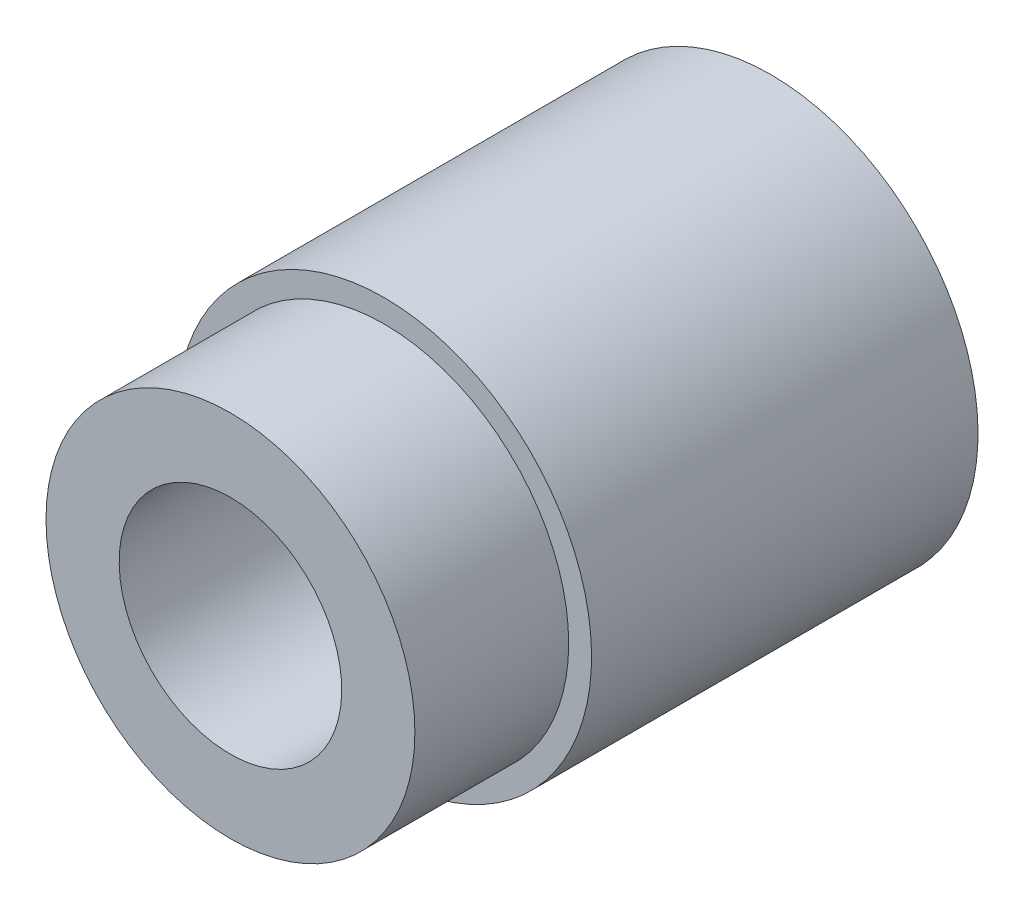
ISO-10303-21;
HEADER;
FILE_DESCRIPTION(('STEP AP214'),'2;1');
FILE_NAME('part.step','',(''),(''),'','','');
FILE_SCHEMA(('AUTOMOTIVE_DESIGN { 1 0 10303 214 1 1 1 1 }'));
ENDSEC;
DATA;
#1=APPLICATION_CONTEXT('core data for automotive mechanical design processes');
#2=APPLICATION_PROTOCOL_DEFINITION('international standard','automotive_design',2000,#1);
#3=PRODUCT_CONTEXT('',#1,'mechanical');
#4=PRODUCT('Part','Part','',(#3));
#5=PRODUCT_RELATED_PRODUCT_CATEGORY('part','',(#4));
#6=PRODUCT_DEFINITION_FORMATION('','',#4);
#7=PRODUCT_DEFINITION_CONTEXT('part definition',#1,'design');
#8=PRODUCT_DEFINITION('design','',#6,#7);
#9=PRODUCT_DEFINITION_SHAPE('','',#8);
#10=(LENGTH_UNIT() NAMED_UNIT(*) SI_UNIT(.MILLI.,.METRE.));
#11=(NAMED_UNIT(*) PLANE_ANGLE_UNIT() SI_UNIT($,.RADIAN.));
#12=(NAMED_UNIT(*) SI_UNIT($,.STERADIAN.) SOLID_ANGLE_UNIT());
#13=UNCERTAINTY_MEASURE_WITH_UNIT(LENGTH_MEASURE(1.E-05),#10,'distance_accuracy_value','');
#14=(GEOMETRIC_REPRESENTATION_CONTEXT(3) GLOBAL_UNCERTAINTY_ASSIGNED_CONTEXT((#13)) GLOBAL_UNIT_ASSIGNED_CONTEXT((#10,
#11,#12)) REPRESENTATION_CONTEXT('',''));
#15=CARTESIAN_POINT('',(0.,0.,0.));
#16=DIRECTION('',(0.,0.,1.));
#17=DIRECTION('',(1.,0.,0.));
#18=AXIS2_PLACEMENT_3D('',#15,#16,#17);
#19=CARTESIAN_POINT('',(0.,6.7437,0.));
#20=DIRECTION('',(0.,0.,-1.));
#21=DIRECTION('',(0.,1.,0.));
#22=AXIS2_PLACEMENT_3D('',#19,#20,#21);
#23=PLANE('',#22);
#24=CARTESIAN_POINT('',(0.,0.,0.));
#25=DIRECTION('',(0.,0.,-1.));
#26=DIRECTION('',(0.,1.,0.));
#27=AXIS2_PLACEMENT_3D('',#24,#25,#26);
#28=CIRCLE('',#27,6.7437);
#29=CARTESIAN_POINT('',(0.,6.7437,0.));
#30=VERTEX_POINT('',#29);
#31=EDGE_CURVE('E52',#30,#30,#28,.T.);
#32=ORIENTED_EDGE('',*,*,#31,.T.);
#33=EDGE_LOOP('',(#32));
#34=FACE_BOUND('',#33,.T.);
#35=CARTESIAN_POINT('',(0.,0.,0.));
#36=DIRECTION('',(0.,0.,-1.));
#37=DIRECTION('',(0.,1.,0.));
#38=AXIS2_PLACEMENT_3D('',#35,#36,#37);
#39=CIRCLE('',#38,3.6195);
#40=CARTESIAN_POINT('',(0.,3.6195,0.));
#41=VERTEX_POINT('',#40);
#42=EDGE_CURVE('E10',#41,#41,#39,.T.);
#43=ORIENTED_EDGE('',*,*,#42,.F.);
#44=EDGE_LOOP('',(#43));
#45=FACE_BOUND('',#44,.T.);
#46=ADVANCED_FACE('F30',(#34,#45),#23,.T.);
#47=CARTESIAN_POINT('',(0.,0.,0.));
#48=DIRECTION('',(0.,0.,-1.));
#49=DIRECTION('',(0.,1.,0.));
#50=AXIS2_PLACEMENT_3D('',#47,#48,#49);
#51=CYLINDRICAL_SURFACE('',#50,3.6195);
#52=ORIENTED_EDGE('',*,*,#42,.T.);
#53=EDGE_LOOP('',(#52));
#54=FACE_BOUND('',#53,.T.);
#55=CARTESIAN_POINT('',(0.,0.,17.5768));
#56=DIRECTION('',(0.,0.,-1.));
#57=DIRECTION('',(0.,1.,0.));
#58=AXIS2_PLACEMENT_3D('',#55,#56,#57);
#59=CIRCLE('',#58,3.6195);
#60=CARTESIAN_POINT('',(0.,3.6195,17.5768));
#61=VERTEX_POINT('',#60);
#62=EDGE_CURVE('E36',#61,#61,#59,.T.);
#63=ORIENTED_EDGE('',*,*,#62,.F.);
#64=EDGE_LOOP('',(#63));
#65=FACE_BOUND('',#64,.T.);
#66=ADVANCED_FACE('F70',(#54,#65),#51,.F.);
#67=CARTESIAN_POINT('',(0.,3.6195,17.5768));
#68=DIRECTION('',(0.,0.,1.));
#69=DIRECTION('',(0.,-1.,0.));
#70=AXIS2_PLACEMENT_3D('',#67,#68,#69);
#71=PLANE('',#70);
#72=ORIENTED_EDGE('',*,*,#62,.T.);
#73=EDGE_LOOP('',(#72));
#74=FACE_BOUND('',#73,.T.);
#75=CARTESIAN_POINT('',(0.,0.,17.5768));
#76=DIRECTION('',(0.,0.,-1.));
#77=DIRECTION('',(0.,1.,0.));
#78=AXIS2_PLACEMENT_3D('',#75,#76,#77);
#79=CIRCLE('',#78,6.);
#80=CARTESIAN_POINT('',(0.,6.,17.5768));
#81=VERTEX_POINT('',#80);
#82=EDGE_CURVE('E40',#81,#81,#79,.T.);
#83=ORIENTED_EDGE('',*,*,#82,.F.);
#84=EDGE_LOOP('',(#83));
#85=FACE_BOUND('',#84,.T.);
#86=ADVANCED_FACE('F74',(#74,#85),#71,.T.);
#87=CARTESIAN_POINT('',(0.,0.,0.));
#88=DIRECTION('',(0.,0.,-1.));
#89=DIRECTION('',(0.,1.,0.));
#90=AXIS2_PLACEMENT_3D('',#87,#88,#89);
#91=CYLINDRICAL_SURFACE('',#90,6.);
#92=ORIENTED_EDGE('',*,*,#82,.T.);
#93=EDGE_LOOP('',(#92));
#94=FACE_BOUND('',#93,.T.);
#95=CARTESIAN_POINT('',(0.,0.,12.573));
#96=DIRECTION('',(0.,0.,-1.));
#97=DIRECTION('',(0.,1.,0.));
#98=AXIS2_PLACEMENT_3D('',#95,#96,#97);
#99=CIRCLE('',#98,6.);
#100=CARTESIAN_POINT('',(0.,6.,12.573));
#101=VERTEX_POINT('',#100);
#102=EDGE_CURVE('E44',#101,#101,#99,.T.);
#103=ORIENTED_EDGE('',*,*,#102,.F.);
#104=EDGE_LOOP('',(#103));
#105=FACE_BOUND('',#104,.T.);
#106=ADVANCED_FACE('F66',(#94,#105),#91,.T.);
#107=CARTESIAN_POINT('',(0.,6.,12.573));
#108=DIRECTION('',(0.,0.,1.));
#109=DIRECTION('',(0.,-1.,0.));
#110=AXIS2_PLACEMENT_3D('',#107,#108,#109);
#111=PLANE('',#110);
#112=ORIENTED_EDGE('',*,*,#102,.T.);
#113=EDGE_LOOP('',(#112));
#114=FACE_BOUND('',#113,.T.);
#115=CARTESIAN_POINT('',(0.,0.,12.573));
#116=DIRECTION('',(0.,0.,-1.));
#117=DIRECTION('',(0.,1.,0.));
#118=AXIS2_PLACEMENT_3D('',#115,#116,#117);
#119=CIRCLE('',#118,6.7437);
#120=CARTESIAN_POINT('',(0.,6.7437,12.573));
#121=VERTEX_POINT('',#120);
#122=EDGE_CURVE('E49',#121,#121,#119,.T.);
#123=ORIENTED_EDGE('',*,*,#122,.F.);
#124=EDGE_LOOP('',(#123));
#125=FACE_BOUND('',#124,.T.);
#126=ADVANCED_FACE('F60',(#114,#125),#111,.T.);
#127=CARTESIAN_POINT('',(0.,0.,0.));
#128=DIRECTION('',(0.,0.,-1.));
#129=DIRECTION('',(0.,1.,0.));
#130=AXIS2_PLACEMENT_3D('',#127,#128,#129);
#131=CYLINDRICAL_SURFACE('',#130,6.7437);
#132=ORIENTED_EDGE('',*,*,#122,.T.);
#133=EDGE_LOOP('',(#132));
#134=FACE_BOUND('',#133,.T.);
#135=ORIENTED_EDGE('',*,*,#31,.F.);
#136=EDGE_LOOP('',(#135));
#137=FACE_BOUND('',#136,.T.);
#138=ADVANCED_FACE('F58',(#134,#137),#131,.T.);
#139=CLOSED_SHELL('',(#46,#66,#86,#106,#126,#138));
#140=MANIFOLD_SOLID_BREP('B2',#139);
#141=ADVANCED_BREP_SHAPE_REPRESENTATION('',(#18,#140),#14);
#142=SHAPE_DEFINITION_REPRESENTATION(#9,#141);
ENDSEC;
END-ISO-10303-21;
